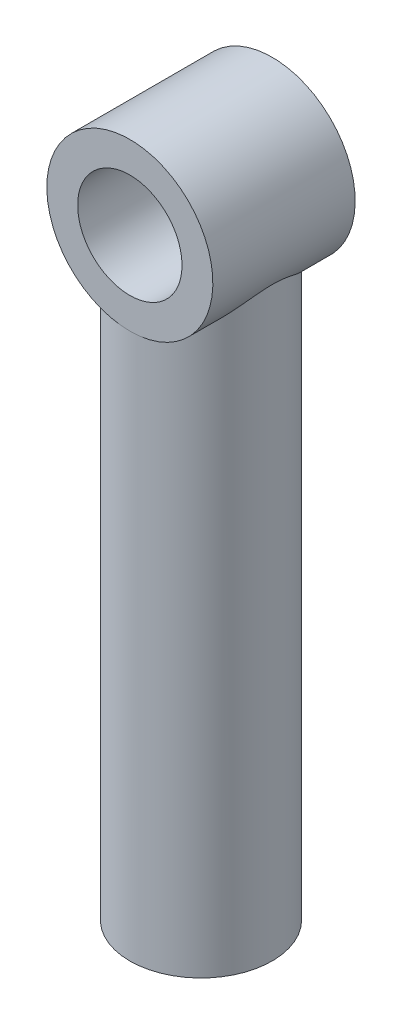
ISO-10303-21;
HEADER;
FILE_DESCRIPTION(('STEP AP214'),'2;1');
FILE_NAME('part.step','',(''),(''),'','','');
FILE_SCHEMA(('AUTOMOTIVE_DESIGN { 1 0 10303 214 1 1 1 1 }'));
ENDSEC;
DATA;
#1=APPLICATION_CONTEXT('core data for automotive mechanical design processes');
#2=APPLICATION_PROTOCOL_DEFINITION('international standard','automotive_design',2000,#1);
#3=PRODUCT_CONTEXT('',#1,'mechanical');
#4=PRODUCT('Part','Part','',(#3));
#5=PRODUCT_RELATED_PRODUCT_CATEGORY('part','',(#4));
#6=PRODUCT_DEFINITION_FORMATION('','',#4);
#7=PRODUCT_DEFINITION_CONTEXT('part definition',#1,'design');
#8=PRODUCT_DEFINITION('design','',#6,#7);
#9=PRODUCT_DEFINITION_SHAPE('','',#8);
#10=(LENGTH_UNIT() NAMED_UNIT(*) SI_UNIT(.MILLI.,.METRE.));
#11=(NAMED_UNIT(*) PLANE_ANGLE_UNIT() SI_UNIT($,.RADIAN.));
#12=(NAMED_UNIT(*) SI_UNIT($,.STERADIAN.) SOLID_ANGLE_UNIT());
#13=UNCERTAINTY_MEASURE_WITH_UNIT(LENGTH_MEASURE(1.E-05),#10,'distance_accuracy_value','');
#14=(GEOMETRIC_REPRESENTATION_CONTEXT(3) GLOBAL_UNCERTAINTY_ASSIGNED_CONTEXT((#13)) GLOBAL_UNIT_ASSIGNED_CONTEXT((#10,
#11,#12)) REPRESENTATION_CONTEXT('',''));
#15=CARTESIAN_POINT('',(0.,0.,0.));
#16=DIRECTION('',(0.,0.,1.));
#17=DIRECTION('',(1.,0.,0.));
#18=AXIS2_PLACEMENT_3D('',#15,#16,#17);
#19=CARTESIAN_POINT('',(0.,65.,0.));
#20=DIRECTION('',(0.,-1.,0.));
#21=DIRECTION('',(0.,0.,-1.));
#22=AXIS2_PLACEMENT_3D('',#19,#20,#21);
#23=CYLINDRICAL_SURFACE('',#22,15.);
#24=CARTESIAN_POINT('',(0.,-65.,0.));
#25=DIRECTION('',(0.,1.,0.));
#26=DIRECTION('',(0.,0.,1.));
#27=AXIS2_PLACEMENT_3D('',#24,#25,#26);
#28=CIRCLE('',#27,15.);
#29=CARTESIAN_POINT('',(0.,-65.,15.));
#30=VERTEX_POINT('',#29);
#31=EDGE_CURVE('E67',#30,#30,#28,.T.);
#32=ORIENTED_EDGE('',*,*,#31,.T.);
#33=EDGE_LOOP('',(#32));
#34=FACE_BOUND('',#33,.T.);
#35=CARTESIAN_POINT('',(0.,50.,-15.));
#36=CARTESIAN_POINT('',(-0.353199767491309,50.0000028726768,-14.9999970621187));
#37=CARTESIAN_POINT('',(-0.706448151538677,50.0107165605458,-14.9875015927131));
#38=CARTESIAN_POINT('',(-1.40993817931645,50.0533290525756,-14.937753776632));
#39=CARTESIAN_POINT('',(-1.76017925236003,50.0852317914797,-14.900496831824));
#40=CARTESIAN_POINT('',(-2.4550219399402,50.1695227930356,-14.8018949739257));
#41=CARTESIAN_POINT('',(-2.7996189285071,50.2219270615794,-14.7405312401));
#42=CARTESIAN_POINT('',(-3.48032005444502,50.3460766795694,-14.5948120571854));
#43=CARTESIAN_POINT('',(-3.81642438896613,50.4178215795865,-14.5104571423549));
#44=CARTESIAN_POINT('',(-4.47593157416871,50.5786957031274,-14.3207210683785));
#45=CARTESIAN_POINT('',(-4.79940088953138,50.6677130210809,-14.2154751631236));
#46=CARTESIAN_POINT('',(-5.4341782858989,50.8617946422375,-13.9851251365136));
#47=CARTESIAN_POINT('',(-5.74548655450117,50.9668586977794,-13.8600213216393));
#48=CARTESIAN_POINT('',(-6.35472944832808,51.1913269079699,-13.5914772292063));
#49=CARTESIAN_POINT('',(-6.65266311987485,51.3107320829903,-13.4480356468672));
#50=CARTESIAN_POINT('',(-7.23430714951045,51.5621445356995,-13.1442951414575));
#51=CARTESIAN_POINT('',(-7.51801439771171,51.6941545506406,-12.9839925561001));
#52=CARTESIAN_POINT('',(-8.17546785975858,52.0212120601425,-12.5841449775326));
#53=CARTESIAN_POINT('',(-8.54254161262025,52.2211753045011,-12.3376084384088));
#54=CARTESIAN_POINT('',(-9.24774985441137,52.6373992216546,-11.8182506771509));
#55=CARTESIAN_POINT('',(-9.58587410385037,52.8536656104558,-11.5454202267486));
#56=CARTESIAN_POINT('',(-10.2336918135624,53.2987208383468,-10.9753437023377));
#57=CARTESIAN_POINT('',(-10.5433152553681,53.5275384233174,-10.6780407276868));
#58=CARTESIAN_POINT('',(-11.1332685901975,53.9929107651885,-10.0614316084497));
#59=CARTESIAN_POINT('',(-11.4136023263324,54.2294645016647,-9.74212835967266));
#60=CARTESIAN_POINT('',(-11.9505843992798,54.7107037769096,-9.07581132935157));
#61=CARTESIAN_POINT('',(-12.2066372227388,54.9554569442644,-8.72836695200046));
#62=CARTESIAN_POINT('',(-12.6885578880929,55.4431353641806,-8.01168264293375));
#63=CARTESIAN_POINT('',(-12.914415802259,55.6860599908867,-7.64243560000551));
#64=CARTESIAN_POINT('',(-13.3349651009096,56.1629140532237,-6.88237085991641));
#65=CARTESIAN_POINT('',(-13.5297213895573,56.3968614263061,-6.49160043432103));
#66=CARTESIAN_POINT('',(-13.8873580341771,56.8475931593809,-5.68640252302183));
#67=CARTESIAN_POINT('',(-14.0502640977782,57.0643912763782,-5.2719944681608));
#68=CARTESIAN_POINT('',(-14.2730179155224,57.3733796662886,-4.61927414698787));
#69=CARTESIAN_POINT('',(-14.3452278034287,57.4761038026228,-4.39011947234173));
#70=CARTESIAN_POINT('',(-14.4795566447212,57.6711432012581,-3.92443412505421));
#71=CARTESIAN_POINT('',(-14.5416741975179,57.7634570182978,-3.68790243406837));
#72=CARTESIAN_POINT('',(-14.6550239412787,57.9349156473474,-3.20795269752733));
#73=CARTESIAN_POINT('',(-14.7062729445559,58.0140807570472,-2.96454595770013));
#74=CARTESIAN_POINT('',(-14.7971820191905,58.1565234690371,-2.47109064215037));
#75=CARTESIAN_POINT('',(-14.8368482832464,58.2198095584708,-2.22104569384092));
#76=CARTESIAN_POINT('',(-14.904316081744,58.3285470427871,-1.71127642313761));
#77=CARTESIAN_POINT('',(-14.93192111412,58.3737021555094,-1.45146170591829));
#78=CARTESIAN_POINT('',(-14.9735759991895,58.442204726791,-0.927874843655925));
#79=CARTESIAN_POINT('',(-14.9876274602491,58.4655547728886,-0.664103171947648));
#80=CARTESIAN_POINT('',(-15.0017180122365,58.4889705003169,-0.135370531368725));
#81=CARTESIAN_POINT('',(-15.0017695000147,58.4890567815015,0.129589177563338));
#82=CARTESIAN_POINT('',(-14.9878875328927,58.4659862762186,0.658110669176929));
#83=CARTESIAN_POINT('',(-14.9739543053967,58.4428298676987,0.9216724745196));
#84=CARTESIAN_POINT('',(-14.9357532296834,58.3800017955356,1.4044859966083));
#85=CARTESIAN_POINT('',(-14.9134090893609,58.3434254651491,1.62430645648428));
#86=CARTESIAN_POINT('',(-14.8594939348969,58.2561874317518,2.06001784196138));
#87=CARTESIAN_POINT('',(-14.8279195939892,58.2055206505555,2.2759073208964));
#88=CARTESIAN_POINT('',(-14.7200390650325,58.0348782617406,2.91688197059741));
#89=CARTESIAN_POINT('',(-14.6306063923635,57.8963145399252,3.33489889888534));
#90=CARTESIAN_POINT('',(-14.4301039563997,57.5979068603936,4.11334815703471));
#91=CARTESIAN_POINT('',(-14.3216033300363,57.4409750250956,4.4756223613978));
#92=CARTESIAN_POINT('',(-14.0810869313756,57.1069545182171,5.18290681439421));
#93=CARTESIAN_POINT('',(-13.9490527285053,56.9298500877781,5.52790325851724));
#94=CARTESIAN_POINT('',(-13.6626580599991,56.5621647020813,6.20211926033082));
#95=CARTESIAN_POINT('',(-13.5082446314079,56.3715523415435,6.53129885343145));
#96=CARTESIAN_POINT('',(-13.1782137125935,55.9826325682174,7.17391698197842));
#97=CARTESIAN_POINT('',(-13.0026015014462,55.7843270795415,7.48735940899241));
#98=CARTESIAN_POINT('',(-12.6154780533347,55.3679373789268,8.12400958826062));
#99=CARTESIAN_POINT('',(-12.4022113164892,55.1495519582522,8.44595254858209));
#100=CARTESIAN_POINT('',(-11.9514760179076,54.7128683402937,9.07254947703183));
#101=CARTESIAN_POINT('',(-11.7140048889218,54.4945701547328,9.37720160585394));
#102=CARTESIAN_POINT('',(-11.2150894023816,54.0619687429262,9.96851200707143));
#103=CARTESIAN_POINT('',(-10.9536712732152,53.84766144807,10.2551894001845));
#104=CARTESIAN_POINT('',(-10.4065363168984,53.4261499983101,10.8099840316414));
#105=CARTESIAN_POINT('',(-10.1208215278853,53.2189452496478,11.0781028233667));
#106=CARTESIAN_POINT('',(-9.54001798120758,52.8250240012072,11.5813716845711));
#107=CARTESIAN_POINT('',(-9.24612391092338,52.6378011919219,11.8175017621186));
#108=CARTESIAN_POINT('',(-8.63646549999713,52.2754409907186,12.2701090774597));
#109=CARTESIAN_POINT('',(-8.32070047386805,52.1003039779415,12.4865856987761));
#110=CARTESIAN_POINT('',(-7.66796698399407,51.7651089362781,12.8977108853057));
#111=CARTESIAN_POINT('',(-7.33101261689008,51.6050410557098,13.0923737276889));
#112=CARTESIAN_POINT('',(-6.63664331536867,51.3028323741833,13.4576655904156));
#113=CARTESIAN_POINT('',(-6.27923256579864,51.1606879254774,13.6282995019164));
#114=CARTESIAN_POINT('',(-5.61032565147532,50.9205768212067,13.9151818886156));
#115=CARTESIAN_POINT('',(-5.30187054150508,50.8192417162498,14.0357129711853));
#116=CARTESIAN_POINT('',(-4.67340916626949,50.6323783709773,14.2572860704542));
#117=CARTESIAN_POINT('',(-4.35340516528245,50.5468470520763,14.3583318830616));
#118=CARTESIAN_POINT('',(-3.70361155777261,50.3931400060524,14.5394964366057));
#119=CARTESIAN_POINT('',(-3.3738269772972,50.3249555315429,14.6196257255223));
#120=CARTESIAN_POINT('',(-2.70636067388567,50.2072142767205,14.757768953488));
#121=CARTESIAN_POINT('',(-2.36867887174635,50.1576576833164,14.8157826706335));
#122=CARTESIAN_POINT('',(-1.6862586667022,50.0780289483838,14.908912180513));
#123=CARTESIAN_POINT('',(-1.34149474070915,50.0480485392689,14.9439201751361));
#124=CARTESIAN_POINT('',(-0.649191019188964,50.0086091734604,14.989959797319));
#125=CARTESIAN_POINT('',(-0.301651216661221,49.9991502685371,15.0009913643924));
#126=CARTESIAN_POINT('',(0.393289635303142,50.0009696973802,14.9988686752838));
#127=CARTESIAN_POINT('',(0.740690687843158,50.0122475379562,14.9857149943092));
#128=CARTESIAN_POINT('',(1.43246123600529,50.0552831717614,14.9354716585704));
#129=CARTESIAN_POINT('',(1.77683085166517,50.0870401503336,14.8983829559378));
#130=CARTESIAN_POINT('',(2.43482039345593,50.1672749352945,14.804523035402));
#131=CARTESIAN_POINT('',(2.7488473327828,50.2143600852254,14.7493895807739));
#132=CARTESIAN_POINT('',(3.37001318634194,50.3246540619592,14.6199744904468));
#133=CARTESIAN_POINT('',(3.67715251274032,50.3878619211363,14.5456940038794));
#134=CARTESIAN_POINT('',(4.28289829697963,50.5293331603742,14.3789942592602));
#135=CARTESIAN_POINT('',(4.58150469589962,50.607596644367,14.2865748759917));
#136=CARTESIAN_POINT('',(5.16886685406442,50.777968143293,14.0847179152109));
#137=CARTESIAN_POINT('',(5.45762129053266,50.8700780084094,13.9752780633194));
#138=CARTESIAN_POINT('',(6.04713360556261,51.0747982823841,13.7310611171315));
#139=CARTESIAN_POINT('',(6.34697135789707,51.1884645629997,13.5949502039471));
#140=CARTESIAN_POINT('',(6.93289400578367,51.4287440822714,13.3057036156908));
#141=CARTESIAN_POINT('',(7.21897853026969,51.5553576699618,13.1525674816423));
#142=CARTESIAN_POINT('',(7.77690527064873,51.8199135703736,12.8305706864905));
#143=CARTESIAN_POINT('',(8.04873973614305,51.9578619453256,12.6617016043219));
#144=CARTESIAN_POINT('',(8.5776385401548,52.2433792253403,12.309552777942));
#145=CARTESIAN_POINT('',(8.83470019302441,52.3909498693555,12.1262704277009));
#146=CARTESIAN_POINT('',(9.45965714599153,52.7705163989766,11.6506403878653));
#147=CARTESIAN_POINT('',(9.81812058606476,53.0075797979262,11.3498774796964));
#148=CARTESIAN_POINT('',(10.5010492499455,53.4945020804375,10.7211745414639));
#149=CARTESIAN_POINT('',(10.8254984563039,53.7443669105338,10.3932218366266));
#150=CARTESIAN_POINT('',(11.4410790886295,54.2519384361265,9.71149217231394));
#151=CARTESIAN_POINT('',(11.7321411863262,54.5096600911151,9.35766388926071));
#152=CARTESIAN_POINT('',(12.2802628121315,55.0265527903279,8.62578556363207));
#153=CARTESIAN_POINT('',(12.537333324577,55.2857233379882,8.24774340464665));
#154=CARTESIAN_POINT('',(12.9624275036437,55.7399442094024,7.55647189524569));
#155=CARTESIAN_POINT('',(13.1373683811543,55.9360993127598,7.24820067999361));
#156=CARTESIAN_POINT('',(13.4666311959439,56.3212709686242,6.61640196547743));
#157=CARTESIAN_POINT('',(13.6209502644624,56.5102865253098,6.29287235202473));
#158=CARTESIAN_POINT('',(13.9078068591434,56.8756548181839,5.63053034317232));
#159=CARTESIAN_POINT('',(14.0403967786284,57.0520374185095,5.2917572963495));
#160=CARTESIAN_POINT('',(14.2828653448176,57.3860360480512,4.59726807697518));
#161=CARTESIAN_POINT('',(14.3927581384012,57.5436637408694,4.24156262938933));
#162=CARTESIAN_POINT('',(14.549865521062,57.7756601579756,3.65438988958291));
#163=CARTESIAN_POINT('',(14.6048413340304,57.8585788952729,3.42836286729838));
#164=CARTESIAN_POINT('',(14.7049272122702,58.0119290108358,2.96987655935575));
#165=CARTESIAN_POINT('',(14.7500359286053,58.0823586814653,2.73741639910727));
#166=CARTESIAN_POINT('',(14.829591563791,58.20813471498,2.26714529364172));
#167=CARTESIAN_POINT('',(14.864060473603,58.2635121599677,2.02934648955242));
#168=CARTESIAN_POINT('',(14.9217515013516,58.3570045755984,1.54911757155557));
#169=CARTESIAN_POINT('',(14.9449795885239,58.3951287076027,1.30668998693328));
#170=CARTESIAN_POINT('',(14.9798202684029,58.4525614097936,0.816128834276101));
#171=CARTESIAN_POINT('',(14.9913071116918,58.471666226651,0.567962021266436));
#172=CARTESIAN_POINT('',(15.0018953093516,58.4892703683479,0.0706368599534814));
#173=CARTESIAN_POINT('',(15.0009973646231,58.4877708592617,-0.178521431440589));
#174=CARTESIAN_POINT('',(14.9868386554834,58.4642461282505,-0.675698024373617));
#175=CARTESIAN_POINT('',(14.9735680295685,58.4422045334972,-0.92371525796537));
#176=CARTESIAN_POINT('',(14.935030556899,58.3788040024786,-1.4163126495295));
#177=CARTESIAN_POINT('',(14.9097617089037,58.3374418436633,-1.66089222710936));
#178=CARTESIAN_POINT('',(14.841966344483,58.2279494120869,-2.19096733510068));
#179=CARTESIAN_POINT('',(14.7970740816806,58.156227822687,-2.47541439771694));
#180=CARTESIAN_POINT('',(14.6923754709897,57.9924495423991,-3.03569849037652));
#181=CARTESIAN_POINT('',(14.6325567781921,57.9003760266757,-3.31152817988469));
#182=CARTESIAN_POINT('',(14.4989954558246,57.6998130356075,-3.85454921129064));
#183=CARTESIAN_POINT('',(14.4252133497676,57.5912771960746,-4.1217134834974));
#184=CARTESIAN_POINT('',(14.264828070745,57.3617399054157,-4.64649746890875));
#185=CARTESIAN_POINT('',(14.1782279702706,57.2407414437058,-4.90411945096259));
#186=CARTESIAN_POINT('',(13.9304691497982,56.9047145212057,-5.58083490856903));
#187=CARTESIAN_POINT('',(13.758388608722,56.6812607188641,-5.99177124227929));
#188=CARTESIAN_POINT('',(13.3824090991639,56.2194836354899,-6.79013393010697));
#189=CARTESIAN_POINT('',(13.1784899135012,55.9811509646538,-7.17754512742391));
#190=CARTESIAN_POINT('',(12.7395445074167,55.497465316717,-7.93058155679522));
#191=CARTESIAN_POINT('',(12.5044766693502,55.2521032976512,-8.2961766756322));
#192=CARTESIAN_POINT('',(12.0038093860058,54.7610218550948,-9.00538148133177));
#193=CARTESIAN_POINT('',(11.7382169695021,54.5153025266959,-9.34899620128082));
#194=CARTESIAN_POINT('',(11.1626772418792,54.0168042053975,-10.0301031556345));
#195=CARTESIAN_POINT('',(10.8511993520086,53.764264540654,-10.3664814240446));
#196=CARTESIAN_POINT('',(10.1942466093422,53.2698776265586,-11.0131632005621));
#197=CARTESIAN_POINT('',(9.84876506412261,53.0280324956787,-11.3234615533861));
#198=CARTESIAN_POINT('',(9.12469741232767,52.5609538777273,-11.9146046938095));
#199=CARTESIAN_POINT('',(8.74619140142054,52.3356825142455,-12.19551729961));
#200=CARTESIAN_POINT('',(7.9559900753698,51.9066008258768,-12.7250993492119));
#201=CARTESIAN_POINT('',(7.54431214396273,51.7027793876572,-12.9737855053334));
#202=CARTESIAN_POINT('',(6.82130578932729,51.3809268873121,-13.3634779806145));
#203=CARTESIAN_POINT('',(6.51822248532943,51.2558335267765,-13.5140287671318));
#204=CARTESIAN_POINT('',(5.89780989495961,51.0204420523827,-13.7960818142436));
#205=CARTESIAN_POINT('',(5.5804843065817,50.9101401272678,-13.92758898244));
#206=CARTESIAN_POINT('',(4.93322419437742,50.7063020379723,-14.1697762627247));
#207=CARTESIAN_POINT('',(4.60330567245291,50.6127454029776,-14.28048181278));
#208=CARTESIAN_POINT('',(3.93224142908309,50.4440014278247,-14.4796370274885));
#209=CARTESIAN_POINT('',(3.59109780755081,50.3688106738264,-14.5680908283763));
#210=CARTESIAN_POINT('',(2.98227072053125,50.2539028820354,-14.7030198442835));
#211=CARTESIAN_POINT('',(2.71646529122722,50.2100023530242,-14.754475516451));
#212=CARTESIAN_POINT('',(2.18071190113142,50.1342960159266,-14.843119918671));
#213=CARTESIAN_POINT('',(1.9107632146659,50.1024923522936,-14.8803061191347));
#214=CARTESIAN_POINT('',(1.36802630606555,50.051424090457,-14.9399812584017));
#215=CARTESIAN_POINT('',(1.09523771735591,50.0321611319193,-14.9624682753248));
#216=CARTESIAN_POINT('',(0.548308975420622,50.0064493896631,-14.9924771304447));
#217=CARTESIAN_POINT('',(0.274169134771639,49.9999977701024,-15.0000022805121));
#218=CARTESIAN_POINT('',(0.,50.,-15.));
#219=B_SPLINE_CURVE_WITH_KNOTS('',3,(#35,#36,#37,#38,#39,#40,#41,#42,#43,#44,#45,#46,#47,#48,
#49,#50,#51,#52,#53,#54,#55,#56,#57,#58,#59,#60,#61,#62,#63,#64,#65,#66,#67,#68,#69,#70,#71,#72,
#73,#74,#75,#76,#77,#78,#79,#80,#81,#82,#83,#84,#85,#86,#87,#88,#89,#90,#91,#92,#93,#94,#95,#96,
#97,#98,#99,#100,#101,#102,#103,#104,#105,#106,#107,#108,#109,#110,#111,#112,#113,#114,#115,
#116,#117,#118,#119,#120,#121,#122,#123,#124,#125,#126,#127,#128,#129,#130,#131,#132,#133,#134,
#135,#136,#137,#138,#139,#140,#141,#142,#143,#144,#145,#146,#147,#148,#149,#150,#151,#152,#153,
#154,#155,#156,#157,#158,#159,#160,#161,#162,#163,#164,#165,#166,#167,#168,#169,#170,#171,#172,
#173,#174,#175,#176,#177,#178,#179,#180,#181,#182,#183,#184,#185,#186,#187,#188,#189,#190,#191,
#192,#193,#194,#195,#196,#197,#198,#199,#200,#201,#202,#203,#204,#205,#206,#207,#208,#209,#210,
#211,#212,#213,#214,#215,#216,#217,#218),.UNSPECIFIED.,.T.,.F.,(4,2,2,2,2,2,2,2,2,2,2,2,2,2,2,2,
2,2,2,2,2,2,2,2,2,2,2,2,2,2,2,2,2,2,2,2,2,2,2,2,2,2,2,2,2,2,2,2,2,2,2,2,2,2,2,2,2,2,2,2,2,2,2,2,
2,2,2,2,2,2,2,2,2,2,2,2,2,2,2,2,2,2,2,2,2,2,2,2,2,2,2,4),(0.,1.05930425052616,2.11880526569319,
3.17913510729301,4.23944031153893,5.29309245204076,6.34672833238348,7.40043922345783,
8.45437945983355,9.90814410853542,11.3624208502252,12.820179967102,14.2777475701166,
15.7648695815661,17.2524793449206,18.7369429482431,20.2202033880403,21.0037007215179,
21.787306694141,22.5696915373935,23.3516573103484,24.1459266925348,24.9401018092976,
25.7335736888494,26.5270326660269,27.1982048003806,27.8696191387291,29.2135755093708,
30.440254042449,31.6678975172703,32.8984952847649,34.1287872295644,35.4587114458245,
36.7887768681756,38.1174025437082,39.4459168765531,40.7075967399164,41.9693161651937,
43.2302049084589,44.490836622084,45.5287968173097,46.5665546037129,47.6037880444796,
48.6410318923856,49.6831019495242,50.725174635536,51.767222537838,52.8092289901852,
53.7750322379364,54.740777535364,55.7065294997736,56.6724106249241,57.7164694072652,
58.7605563428264,59.8052053725381,60.8500437190397,62.4214400416217,63.9935730487409,
65.5689136506208,67.1437439325752,68.3582965709559,69.5730179938225,70.7847659580108,
71.9957563579194,72.7361228607285,73.4765905162883,74.2155173217854,74.9540513017871,
75.7004146732985,76.4467358055434,77.1936522934823,77.9406934069646,78.8295742836808,
79.7191927604975,80.611364934229,81.5033235983392,82.9962580489132,84.4901443807017,
85.9860472043448,87.481606259883,89.050031271373,90.6187655918102,92.1837956800834,
93.7480108831898,94.8294354391236,95.9105808106064,96.9903953373915,98.0700089958348,
98.8922162564602,99.7145692047836,100.537029652129,101.359308024194),.UNSPECIFIED.);
#220=CARTESIAN_POINT('',(0.,50.,-15.));
#221=VERTEX_POINT('',#220);
#222=CARTESIAN_POINT('',(0.,50.,15.));
#223=VERTEX_POINT('',#222);
#224=EDGE_CURVE('E11',#221,#223,#219,.T.);
#225=ORIENTED_EDGE('',*,*,#224,.F.);
#226=EDGE_CURVE('E43',#223,#221,#219,.T.);
#227=ORIENTED_EDGE('',*,*,#226,.F.);
#228=EDGE_LOOP('',(#225,#227));
#229=FACE_BOUND('',#228,.T.);
#230=ADVANCED_FACE('F39',(#34,#229),#23,.T.);
#231=CARTESIAN_POINT('',(0.,-65.,0.));
#232=DIRECTION('',(0.,1.,0.));
#233=DIRECTION('',(0.,0.,1.));
#234=AXIS2_PLACEMENT_3D('',#231,#232,#233);
#235=PLANE('',#234);
#236=ORIENTED_EDGE('',*,*,#31,.F.);
#237=EDGE_LOOP('',(#236));
#238=FACE_BOUND('',#237,.T.);
#239=ADVANCED_FACE('F99',(#238),#235,.F.);
#240=CARTESIAN_POINT('',(0.,67.5,15.));
#241=DIRECTION('',(0.,0.,-1.));
#242=DIRECTION('',(-1.,0.,0.));
#243=AXIS2_PLACEMENT_3D('',#240,#241,#242);
#244=CYLINDRICAL_SURFACE('',#243,17.5);
#245=CARTESIAN_POINT('',(0.,67.5,-15.));
#246=DIRECTION('',(0.,0.,1.));
#247=DIRECTION('',(1.,0.,0.));
#248=AXIS2_PLACEMENT_3D('',#245,#246,#247);
#249=CIRCLE('',#248,17.5);
#250=EDGE_CURVE('E64',#221,#221,#249,.T.);
#251=ORIENTED_EDGE('',*,*,#250,.T.);
#252=ORIENTED_EDGE('',*,*,#224,.T.);
#253=CARTESIAN_POINT('',(0.,67.5,15.));
#254=DIRECTION('',(0.,0.,1.));
#255=DIRECTION('',(1.,0.,0.));
#256=AXIS2_PLACEMENT_3D('',#253,#254,#255);
#257=CIRCLE('',#256,17.5);
#258=EDGE_CURVE('E65',#223,#223,#257,.T.);
#259=ORIENTED_EDGE('',*,*,#258,.F.);
#260=ORIENTED_EDGE('',*,*,#226,.T.);
#261=EDGE_LOOP('',(#251,#252,#259,#260));
#262=FACE_BOUND('',#261,.T.);
#263=ADVANCED_FACE('F62',(#262),#244,.T.);
#264=CARTESIAN_POINT('',(0.,67.5,15.));
#265=DIRECTION('',(0.,0.,1.));
#266=DIRECTION('',(1.,0.,0.));
#267=AXIS2_PLACEMENT_3D('',#264,#265,#266);
#268=PLANE('',#267);
#269=CARTESIAN_POINT('',(0.,67.5,15.));
#270=DIRECTION('',(0.,0.,1.));
#271=DIRECTION('',(1.,0.,0.));
#272=AXIS2_PLACEMENT_3D('',#269,#270,#271);
#273=CIRCLE('',#272,11.);
#274=CARTESIAN_POINT('',(11.,67.5,15.));
#275=VERTEX_POINT('',#274);
#276=EDGE_CURVE('E81',#275,#275,#273,.T.);
#277=ORIENTED_EDGE('',*,*,#276,.F.);
#278=EDGE_LOOP('',(#277));
#279=FACE_BOUND('',#278,.T.);
#280=ORIENTED_EDGE('',*,*,#258,.T.);
#281=EDGE_LOOP('',(#280));
#282=FACE_BOUND('',#281,.T.);
#283=ADVANCED_FACE('F88',(#279,#282),#268,.T.);
#284=CARTESIAN_POINT('',(0.,67.5,-15.));
#285=DIRECTION('',(0.,0.,1.));
#286=DIRECTION('',(1.,0.,0.));
#287=AXIS2_PLACEMENT_3D('',#284,#285,#286);
#288=PLANE('',#287);
#289=CARTESIAN_POINT('',(0.,67.5,-15.));
#290=DIRECTION('',(0.,0.,1.));
#291=DIRECTION('',(1.,0.,0.));
#292=AXIS2_PLACEMENT_3D('',#289,#290,#291);
#293=CIRCLE('',#292,11.);
#294=CARTESIAN_POINT('',(11.,67.5,-15.));
#295=VERTEX_POINT('',#294);
#296=EDGE_CURVE('E76',#295,#295,#293,.T.);
#297=ORIENTED_EDGE('',*,*,#296,.T.);
#298=EDGE_LOOP('',(#297));
#299=FACE_BOUND('',#298,.T.);
#300=ORIENTED_EDGE('',*,*,#250,.F.);
#301=EDGE_LOOP('',(#300));
#302=FACE_BOUND('',#301,.T.);
#303=ADVANCED_FACE('F91',(#299,#302),#288,.F.);
#304=CARTESIAN_POINT('',(0.,67.5,-15.));
#305=DIRECTION('',(0.,0.,1.));
#306=DIRECTION('',(1.,0.,0.));
#307=AXIS2_PLACEMENT_3D('',#304,#305,#306);
#308=CYLINDRICAL_SURFACE('',#307,11.);
#309=ORIENTED_EDGE('',*,*,#296,.F.);
#310=EDGE_LOOP('',(#309));
#311=FACE_BOUND('',#310,.T.);
#312=ORIENTED_EDGE('',*,*,#276,.T.);
#313=EDGE_LOOP('',(#312));
#314=FACE_BOUND('',#313,.T.);
#315=ADVANCED_FACE('F86',(#311,#314),#308,.F.);
#316=CLOSED_SHELL('',(#230,#239,#263,#283,#303,#315));
#317=MANIFOLD_SOLID_BREP('B2',#316);
#318=ADVANCED_BREP_SHAPE_REPRESENTATION('',(#18,#317),#14);
#319=SHAPE_DEFINITION_REPRESENTATION(#9,#318);
ENDSEC;
END-ISO-10303-21;
